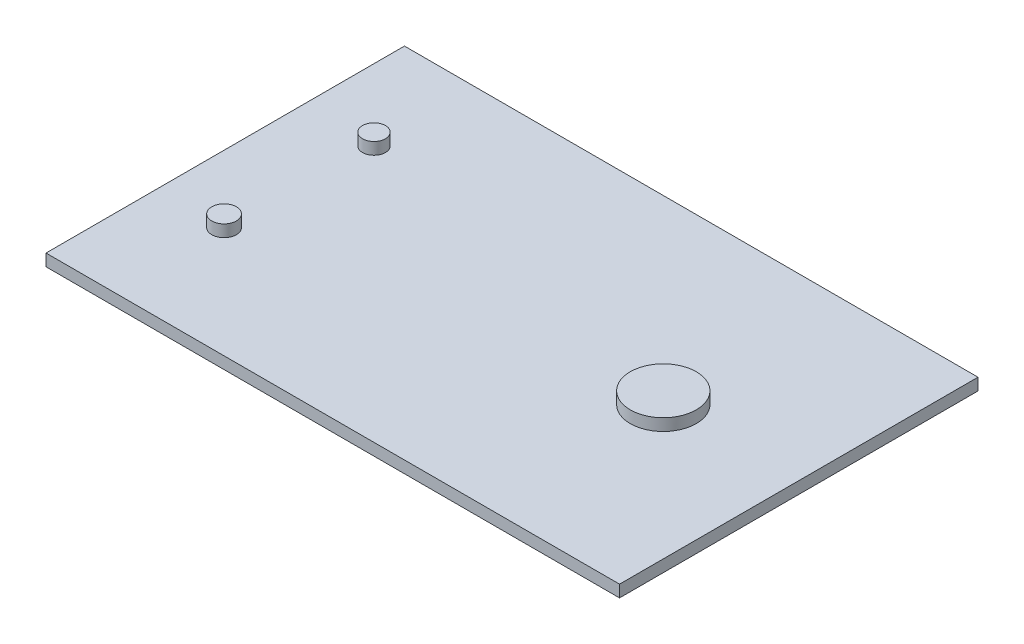
ISO-10303-21;
HEADER;
FILE_DESCRIPTION(('STEP AP214'),'2;1');
FILE_NAME('part.step','',(''),(''),'','','');
FILE_SCHEMA(('AUTOMOTIVE_DESIGN { 1 0 10303 214 1 1 1 1 }'));
ENDSEC;
DATA;
#1=APPLICATION_CONTEXT('core data for automotive mechanical design processes');
#2=APPLICATION_PROTOCOL_DEFINITION('international standard','automotive_design',2000,#1);
#3=PRODUCT_CONTEXT('',#1,'mechanical');
#4=PRODUCT('Part','Part','',(#3));
#5=PRODUCT_RELATED_PRODUCT_CATEGORY('part','',(#4));
#6=PRODUCT_DEFINITION_FORMATION('','',#4);
#7=PRODUCT_DEFINITION_CONTEXT('part definition',#1,'design');
#8=PRODUCT_DEFINITION('design','',#6,#7);
#9=PRODUCT_DEFINITION_SHAPE('','',#8);
#10=(LENGTH_UNIT() NAMED_UNIT(*) SI_UNIT(.MILLI.,.METRE.));
#11=(NAMED_UNIT(*) PLANE_ANGLE_UNIT() SI_UNIT($,.RADIAN.));
#12=(NAMED_UNIT(*) SI_UNIT($,.STERADIAN.) SOLID_ANGLE_UNIT());
#13=UNCERTAINTY_MEASURE_WITH_UNIT(LENGTH_MEASURE(1.E-05),#10,'distance_accuracy_value','');
#14=(GEOMETRIC_REPRESENTATION_CONTEXT(3) GLOBAL_UNCERTAINTY_ASSIGNED_CONTEXT((#13)) GLOBAL_UNIT_ASSIGNED_CONTEXT((#10,
#11,#12)) REPRESENTATION_CONTEXT('',''));
#15=CARTESIAN_POINT('',(0.,0.,0.));
#16=DIRECTION('',(0.,0.,1.));
#17=DIRECTION('',(1.,0.,0.));
#18=AXIS2_PLACEMENT_3D('',#15,#16,#17);
#19=CARTESIAN_POINT('',(0.,1.27,0.));
#20=DIRECTION('',(1.,0.,0.));
#21=DIRECTION('',(0.,0.,-1.));
#22=AXIS2_PLACEMENT_3D('',#19,#20,#21);
#23=PLANE('',#22);
#24=DIRECTION('',(0.,0.,1.));
#25=VECTOR('',#24,1.);
#26=CARTESIAN_POINT('',(0.,0.,0.));
#27=LINE('',#26,#25);
#28=CARTESIAN_POINT('',(0.,0.,-38.1));
#29=VERTEX_POINT('',#28);
#30=CARTESIAN_POINT('',(0.,0.,0.));
#31=VERTEX_POINT('',#30);
#32=EDGE_CURVE('E100',#29,#31,#27,.T.);
#33=ORIENTED_EDGE('',*,*,#32,.T.);
#34=DIRECTION('',(0.,-1.,0.));
#35=VECTOR('',#34,1.);
#36=CARTESIAN_POINT('',(0.,1.27,0.));
#37=LINE('',#36,#35);
#38=CARTESIAN_POINT('',(0.,1.27,0.));
#39=VERTEX_POINT('',#38);
#40=EDGE_CURVE('E91',#39,#31,#37,.T.);
#41=ORIENTED_EDGE('',*,*,#40,.F.);
#42=DIRECTION('',(0.,0.,1.));
#43=VECTOR('',#42,1.);
#44=CARTESIAN_POINT('',(0.,1.27,0.));
#45=LINE('',#44,#43);
#46=CARTESIAN_POINT('',(0.,1.27,-38.1));
#47=VERTEX_POINT('',#46);
#48=EDGE_CURVE('E85',#47,#39,#45,.T.);
#49=ORIENTED_EDGE('',*,*,#48,.F.);
#50=DIRECTION('',(0.,-1.,0.));
#51=VECTOR('',#50,1.);
#52=CARTESIAN_POINT('',(0.,1.27,-38.1));
#53=LINE('',#52,#51);
#54=EDGE_CURVE('E96',#47,#29,#53,.T.);
#55=ORIENTED_EDGE('',*,*,#54,.T.);
#56=EDGE_LOOP('',(#33,#41,#49,#55));
#57=FACE_BOUND('',#56,.T.);
#58=ADVANCED_FACE('F33',(#57),#23,.F.);
#59=CARTESIAN_POINT('',(0.,1.27,0.));
#60=DIRECTION('',(0.,0.,-1.));
#61=DIRECTION('',(-1.,0.,0.));
#62=AXIS2_PLACEMENT_3D('',#59,#60,#61);
#63=PLANE('',#62);
#64=DIRECTION('',(1.,0.,0.));
#65=VECTOR('',#64,1.);
#66=CARTESIAN_POINT('',(0.,0.,0.));
#67=LINE('',#66,#65);
#68=CARTESIAN_POINT('',(60.96,0.,0.));
#69=VERTEX_POINT('',#68);
#70=EDGE_CURVE('E90',#31,#69,#67,.T.);
#71=ORIENTED_EDGE('',*,*,#70,.T.);
#72=DIRECTION('',(0.,-1.,0.));
#73=VECTOR('',#72,1.);
#74=CARTESIAN_POINT('',(60.96,1.27,0.));
#75=LINE('',#74,#73);
#76=CARTESIAN_POINT('',(60.96,1.27,0.));
#77=VERTEX_POINT('',#76);
#78=EDGE_CURVE('E88',#77,#69,#75,.T.);
#79=ORIENTED_EDGE('',*,*,#78,.F.);
#80=DIRECTION('',(1.,0.,0.));
#81=VECTOR('',#80,1.);
#82=CARTESIAN_POINT('',(0.,1.27,0.));
#83=LINE('',#82,#81);
#84=EDGE_CURVE('E80',#39,#77,#83,.T.);
#85=ORIENTED_EDGE('',*,*,#84,.F.);
#86=ORIENTED_EDGE('',*,*,#40,.T.);
#87=EDGE_LOOP('',(#71,#79,#85,#86));
#88=FACE_BOUND('',#87,.T.);
#89=ADVANCED_FACE('F89',(#88),#63,.F.);
#90=CARTESIAN_POINT('',(60.96,1.27,0.));
#91=DIRECTION('',(-1.,0.,0.));
#92=DIRECTION('',(0.,0.,1.));
#93=AXIS2_PLACEMENT_3D('',#90,#91,#92);
#94=PLANE('',#93);
#95=DIRECTION('',(0.,0.,-1.));
#96=VECTOR('',#95,1.);
#97=CARTESIAN_POINT('',(60.96,0.,0.));
#98=LINE('',#97,#96);
#99=CARTESIAN_POINT('',(60.96,0.,-38.1));
#100=VERTEX_POINT('',#99);
#101=EDGE_CURVE('E66',#69,#100,#98,.T.);
#102=ORIENTED_EDGE('',*,*,#101,.T.);
#103=DIRECTION('',(0.,-1.,0.));
#104=VECTOR('',#103,1.);
#105=CARTESIAN_POINT('',(60.96,1.27,-38.1));
#106=LINE('',#105,#104);
#107=CARTESIAN_POINT('',(60.96,1.27,-38.1));
#108=VERTEX_POINT('',#107);
#109=EDGE_CURVE('E92',#108,#100,#106,.T.);
#110=ORIENTED_EDGE('',*,*,#109,.F.);
#111=DIRECTION('',(0.,0.,-1.));
#112=VECTOR('',#111,1.);
#113=CARTESIAN_POINT('',(60.96,1.27,0.));
#114=LINE('',#113,#112);
#115=EDGE_CURVE('E83',#77,#108,#114,.T.);
#116=ORIENTED_EDGE('',*,*,#115,.F.);
#117=ORIENTED_EDGE('',*,*,#78,.T.);
#118=EDGE_LOOP('',(#102,#110,#116,#117));
#119=FACE_BOUND('',#118,.T.);
#120=ADVANCED_FACE('F94',(#119),#94,.F.);
#121=CARTESIAN_POINT('',(0.,1.27,-38.1));
#122=DIRECTION('',(0.,0.,1.));
#123=DIRECTION('',(1.,0.,0.));
#124=AXIS2_PLACEMENT_3D('',#121,#122,#123);
#125=PLANE('',#124);
#126=DIRECTION('',(-1.,0.,0.));
#127=VECTOR('',#126,1.);
#128=CARTESIAN_POINT('',(0.,0.,-38.1));
#129=LINE('',#128,#127);
#130=EDGE_CURVE('E72',#100,#29,#129,.T.);
#131=ORIENTED_EDGE('',*,*,#130,.T.);
#132=ORIENTED_EDGE('',*,*,#54,.F.);
#133=DIRECTION('',(-1.,0.,0.));
#134=VECTOR('',#133,1.);
#135=CARTESIAN_POINT('',(0.,1.27,-38.1));
#136=LINE('',#135,#134);
#137=EDGE_CURVE('E49',#108,#47,#136,.T.);
#138=ORIENTED_EDGE('',*,*,#137,.F.);
#139=ORIENTED_EDGE('',*,*,#109,.T.);
#140=EDGE_LOOP('',(#131,#132,#138,#139));
#141=FACE_BOUND('',#140,.T.);
#142=ADVANCED_FACE('F120',(#141),#125,.F.);
#143=CARTESIAN_POINT('',(0.,1.27,0.));
#144=DIRECTION('',(0.,-1.,0.));
#145=DIRECTION('',(0.,0.,-1.));
#146=AXIS2_PLACEMENT_3D('',#143,#144,#145);
#147=PLANE('',#146);
#148=CARTESIAN_POINT('',(7.12914572297019,1.27,-11.7978542049107));
#149=DIRECTION('',(0.,-1.,0.));
#150=DIRECTION('',(0.,0.,-1.));
#151=AXIS2_PLACEMENT_3D('',#148,#149,#150);
#152=CIRCLE('',#151,1.3067624367859);
#153=CARTESIAN_POINT('',(7.12914572297019,1.27,-13.1046166416966));
#154=VERTEX_POINT('',#153);
#155=EDGE_CURVE('E11',#154,#154,#152,.F.);
#156=ORIENTED_EDGE('',*,*,#155,.F.);
#157=EDGE_LOOP('',(#156));
#158=FACE_BOUND('',#157,.T.);
#159=CARTESIAN_POINT('',(7.57381553321501,1.27,-27.2872252021975));
#160=DIRECTION('',(0.,-1.,0.));
#161=DIRECTION('',(0.,0.,-1.));
#162=AXIS2_PLACEMENT_3D('',#159,#160,#161);
#163=CIRCLE('',#162,1.21832779139529);
#164=CARTESIAN_POINT('',(7.57381553321501,1.27,-28.5055529935928));
#165=VERTEX_POINT('',#164);
#166=EDGE_CURVE('E41',#165,#165,#163,.F.);
#167=ORIENTED_EDGE('',*,*,#166,.F.);
#168=EDGE_LOOP('',(#167));
#169=FACE_BOUND('',#168,.T.);
#170=CARTESIAN_POINT('',(46.7554503326113,1.27,-18.8533166361537));
#171=DIRECTION('',(0.,-1.,0.));
#172=DIRECTION('',(0.,0.,-1.));
#173=AXIS2_PLACEMENT_3D('',#170,#171,#172);
#174=CIRCLE('',#173,3.50818276321064);
#175=CARTESIAN_POINT('',(46.7554503326113,1.27,-22.3614993993644));
#176=VERTEX_POINT('',#175);
#177=EDGE_CURVE('E110',#176,#176,#174,.F.);
#178=ORIENTED_EDGE('',*,*,#177,.F.);
#179=EDGE_LOOP('',(#178));
#180=FACE_BOUND('',#179,.T.);
#181=ORIENTED_EDGE('',*,*,#48,.T.);
#182=ORIENTED_EDGE('',*,*,#84,.T.);
#183=ORIENTED_EDGE('',*,*,#115,.T.);
#184=ORIENTED_EDGE('',*,*,#137,.T.);
#185=EDGE_LOOP('',(#181,#182,#183,#184));
#186=FACE_BOUND('',#185,.T.);
#187=ADVANCED_FACE('F81',(#158,#169,#180,#186),#147,.F.);
#188=CARTESIAN_POINT('',(0.,0.,0.));
#189=DIRECTION('',(0.,-1.,0.));
#190=DIRECTION('',(0.,0.,-1.));
#191=AXIS2_PLACEMENT_3D('',#188,#189,#190);
#192=PLANE('',#191);
#193=ORIENTED_EDGE('',*,*,#32,.F.);
#194=ORIENTED_EDGE('',*,*,#130,.F.);
#195=ORIENTED_EDGE('',*,*,#101,.F.);
#196=ORIENTED_EDGE('',*,*,#70,.F.);
#197=EDGE_LOOP('',(#193,#194,#195,#196));
#198=FACE_BOUND('',#197,.T.);
#199=ADVANCED_FACE('F119',(#198),#192,.T.);
#200=CARTESIAN_POINT('',(46.7554503326113,2.54,-18.8533166361537));
#201=DIRECTION('',(0.,-1.,0.));
#202=DIRECTION('',(0.,0.,-1.));
#203=AXIS2_PLACEMENT_3D('',#200,#201,#202);
#204=CYLINDRICAL_SURFACE('',#203,3.50818276321064);
#205=CARTESIAN_POINT('',(46.7554503326113,2.54,-18.8533166361537));
#206=DIRECTION('',(0.,1.,0.));
#207=DIRECTION('',(0.,0.,1.));
#208=AXIS2_PLACEMENT_3D('',#205,#206,#207);
#209=CIRCLE('',#208,3.50818276321064);
#210=CARTESIAN_POINT('',(46.7554503326113,2.54,-15.3451338729431));
#211=VERTEX_POINT('',#210);
#212=EDGE_CURVE('E103',#211,#211,#209,.T.);
#213=ORIENTED_EDGE('',*,*,#212,.F.);
#214=EDGE_LOOP('',(#213));
#215=FACE_BOUND('',#214,.T.);
#216=ORIENTED_EDGE('',*,*,#177,.T.);
#217=EDGE_LOOP('',(#216));
#218=FACE_BOUND('',#217,.T.);
#219=ADVANCED_FACE('F125',(#215,#218),#204,.T.);
#220=CARTESIAN_POINT('',(46.7554503326113,2.54,-18.8533166361537));
#221=DIRECTION('',(0.,1.,0.));
#222=DIRECTION('',(0.,0.,1.));
#223=AXIS2_PLACEMENT_3D('',#220,#221,#222);
#224=PLANE('',#223);
#225=ORIENTED_EDGE('',*,*,#212,.T.);
#226=EDGE_LOOP('',(#225));
#227=FACE_BOUND('',#226,.T.);
#228=ADVANCED_FACE('F127',(#227),#224,.T.);
#229=CARTESIAN_POINT('',(7.57381553321501,2.54,-27.2872252021975));
#230=DIRECTION('',(0.,-1.,0.));
#231=DIRECTION('',(0.,0.,-1.));
#232=AXIS2_PLACEMENT_3D('',#229,#230,#231);
#233=CYLINDRICAL_SURFACE('',#232,1.21832779139529);
#234=CARTESIAN_POINT('',(7.57381553321501,2.54,-27.2872252021975));
#235=DIRECTION('',(0.,1.,0.));
#236=DIRECTION('',(0.,0.,1.));
#237=AXIS2_PLACEMENT_3D('',#234,#235,#236);
#238=CIRCLE('',#237,1.21832779139529);
#239=CARTESIAN_POINT('',(7.57381553321501,2.54,-26.0688974108022));
#240=VERTEX_POINT('',#239);
#241=EDGE_CURVE('E233',#240,#240,#238,.T.);
#242=ORIENTED_EDGE('',*,*,#241,.F.);
#243=EDGE_LOOP('',(#242));
#244=FACE_BOUND('',#243,.T.);
#245=ORIENTED_EDGE('',*,*,#166,.T.);
#246=EDGE_LOOP('',(#245));
#247=FACE_BOUND('',#246,.T.);
#248=ADVANCED_FACE('F115',(#244,#247),#233,.T.);
#249=CARTESIAN_POINT('',(7.57381553321501,2.54,-27.2872252021975));
#250=DIRECTION('',(0.,1.,0.));
#251=DIRECTION('',(0.,0.,1.));
#252=AXIS2_PLACEMENT_3D('',#249,#250,#251);
#253=PLANE('',#252);
#254=ORIENTED_EDGE('',*,*,#241,.T.);
#255=EDGE_LOOP('',(#254));
#256=FACE_BOUND('',#255,.T.);
#257=ADVANCED_FACE('F198',(#256),#253,.T.);
#258=CARTESIAN_POINT('',(7.12914572297019,2.54,-11.7978542049107));
#259=DIRECTION('',(0.,-1.,0.));
#260=DIRECTION('',(0.,0.,-1.));
#261=AXIS2_PLACEMENT_3D('',#258,#259,#260);
#262=CYLINDRICAL_SURFACE('',#261,1.3067624367859);
#263=CARTESIAN_POINT('',(7.12914572297019,2.54,-11.7978542049107));
#264=DIRECTION('',(0.,1.,0.));
#265=DIRECTION('',(0.,0.,1.));
#266=AXIS2_PLACEMENT_3D('',#263,#264,#265);
#267=CIRCLE('',#266,1.3067624367859);
#268=CARTESIAN_POINT('',(7.12914572297019,2.54,-10.4910917681248));
#269=VERTEX_POINT('',#268);
#270=EDGE_CURVE('E232',#269,#269,#267,.T.);
#271=ORIENTED_EDGE('',*,*,#270,.F.);
#272=EDGE_LOOP('',(#271));
#273=FACE_BOUND('',#272,.T.);
#274=ORIENTED_EDGE('',*,*,#155,.T.);
#275=EDGE_LOOP('',(#274));
#276=FACE_BOUND('',#275,.T.);
#277=ADVANCED_FACE('F206',(#273,#276),#262,.T.);
#278=CARTESIAN_POINT('',(7.12914572297019,2.54,-11.7978542049107));
#279=DIRECTION('',(0.,1.,0.));
#280=DIRECTION('',(0.,0.,1.));
#281=AXIS2_PLACEMENT_3D('',#278,#279,#280);
#282=PLANE('',#281);
#283=ORIENTED_EDGE('',*,*,#270,.T.);
#284=EDGE_LOOP('',(#283));
#285=FACE_BOUND('',#284,.T.);
#286=ADVANCED_FACE('F214',(#285),#282,.T.);
#287=CLOSED_SHELL('',(#58,#89,#120,#142,#187,#199,#219,#228,#248,#257,#277,#286));
#288=MANIFOLD_SOLID_BREP('B2',#287);
#289=ADVANCED_BREP_SHAPE_REPRESENTATION('',(#18,#288),#14);
#290=SHAPE_DEFINITION_REPRESENTATION(#9,#289);
ENDSEC;
END-ISO-10303-21;
